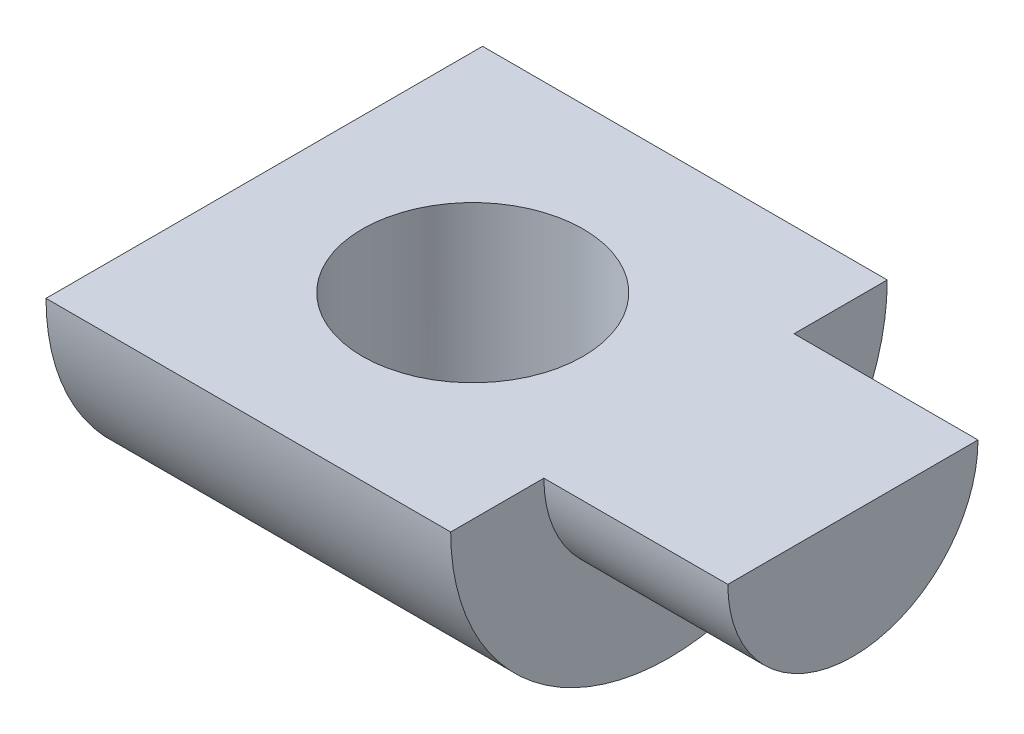
ISO-10303-21;
HEADER;
FILE_DESCRIPTION(('STEP AP214'),'2;1');
FILE_NAME('part.step','',(''),(''),'','','');
FILE_SCHEMA(('AUTOMOTIVE_DESIGN { 1 0 10303 214 1 1 1 1 }'));
ENDSEC;
DATA;
#1=APPLICATION_CONTEXT('core data for automotive mechanical design processes');
#2=APPLICATION_PROTOCOL_DEFINITION('international standard','automotive_design',2000,#1);
#3=PRODUCT_CONTEXT('',#1,'mechanical');
#4=PRODUCT('Part','Part','',(#3));
#5=PRODUCT_RELATED_PRODUCT_CATEGORY('part','',(#4));
#6=PRODUCT_DEFINITION_FORMATION('','',#4);
#7=PRODUCT_DEFINITION_CONTEXT('part definition',#1,'design');
#8=PRODUCT_DEFINITION('design','',#6,#7);
#9=PRODUCT_DEFINITION_SHAPE('','',#8);
#10=(LENGTH_UNIT() NAMED_UNIT(*) SI_UNIT(.MILLI.,.METRE.));
#11=(NAMED_UNIT(*) PLANE_ANGLE_UNIT() SI_UNIT($,.RADIAN.));
#12=(NAMED_UNIT(*) SI_UNIT($,.STERADIAN.) SOLID_ANGLE_UNIT());
#13=UNCERTAINTY_MEASURE_WITH_UNIT(LENGTH_MEASURE(1.E-05),#10,'distance_accuracy_value','');
#14=(GEOMETRIC_REPRESENTATION_CONTEXT(3) GLOBAL_UNCERTAINTY_ASSIGNED_CONTEXT((#13)) GLOBAL_UNIT_ASSIGNED_CONTEXT((#10,
#11,#12)) REPRESENTATION_CONTEXT('',''));
#15=CARTESIAN_POINT('',(0.,0.,0.));
#16=DIRECTION('',(0.,0.,1.));
#17=DIRECTION('',(1.,0.,0.));
#18=AXIS2_PLACEMENT_3D('',#15,#16,#17);
#19=CARTESIAN_POINT('',(-120.,-89.,-89.));
#20=DIRECTION('',(-1.,0.,0.));
#21=DIRECTION('',(0.,0.,1.));
#22=AXIS2_PLACEMENT_3D('',#19,#20,#21);
#23=PLANE('',#22);
#24=CARTESIAN_POINT('',(-120.,0.,0.));
#25=DIRECTION('',(1.,0.,0.));
#26=DIRECTION('',(0.,0.,-1.));
#27=AXIS2_PLACEMENT_3D('',#24,#25,#26);
#28=CIRCLE('',#27,89.);
#29=CARTESIAN_POINT('',(-120.,0.,89.));
#30=VERTEX_POINT('',#29);
#31=CARTESIAN_POINT('',(-120.,0.,-89.));
#32=VERTEX_POINT('',#31);
#33=EDGE_CURVE('E82',#30,#32,#28,.T.);
#34=ORIENTED_EDGE('',*,*,#33,.F.);
#35=DIRECTION('',(0.,0.,1.));
#36=VECTOR('',#35,1.);
#37=CARTESIAN_POINT('',(-120.,0.,-89.));
#38=LINE('',#37,#36);
#39=EDGE_CURVE('E124',#32,#30,#38,.T.);
#40=ORIENTED_EDGE('',*,*,#39,.F.);
#41=EDGE_LOOP('',(#34,#40));
#42=FACE_BOUND('',#41,.T.);
#43=ADVANCED_FACE('F55',(#42),#23,.T.);
#44=CARTESIAN_POINT('',(45.,-89.,-89.));
#45=DIRECTION('',(-1.,0.,0.));
#46=DIRECTION('',(0.,0.,1.));
#47=AXIS2_PLACEMENT_3D('',#44,#45,#46);
#48=PLANE('',#47);
#49=CARTESIAN_POINT('',(45.,0.,0.));
#50=DIRECTION('',(1.,0.,0.));
#51=DIRECTION('',(0.,0.,1.));
#52=AXIS2_PLACEMENT_3D('',#49,#50,#51);
#53=CIRCLE('',#52,51.);
#54=CARTESIAN_POINT('',(45.,0.,51.));
#55=VERTEX_POINT('',#54);
#56=CARTESIAN_POINT('',(45.,0.,-51.));
#57=VERTEX_POINT('',#56);
#58=EDGE_CURVE('E74',#55,#57,#53,.T.);
#59=ORIENTED_EDGE('',*,*,#58,.F.);
#60=DIRECTION('',(0.,0.,1.));
#61=VECTOR('',#60,1.);
#62=CARTESIAN_POINT('',(45.,0.,-89.));
#63=LINE('',#62,#61);
#64=CARTESIAN_POINT('',(45.,0.,89.));
#65=VERTEX_POINT('',#64);
#66=EDGE_CURVE('E130',#55,#65,#63,.T.);
#67=ORIENTED_EDGE('',*,*,#66,.T.);
#68=CARTESIAN_POINT('',(45.,0.,0.));
#69=DIRECTION('',(1.,0.,0.));
#70=DIRECTION('',(0.,0.,-1.));
#71=AXIS2_PLACEMENT_3D('',#68,#69,#70);
#72=CIRCLE('',#71,89.);
#73=CARTESIAN_POINT('',(45.,0.,-89.));
#74=VERTEX_POINT('',#73);
#75=EDGE_CURVE('E117',#65,#74,#72,.T.);
#76=ORIENTED_EDGE('',*,*,#75,.T.);
#77=EDGE_CURVE('E131',#74,#57,#63,.T.);
#78=ORIENTED_EDGE('',*,*,#77,.T.);
#79=EDGE_LOOP('',(#59,#67,#76,#78));
#80=FACE_BOUND('',#79,.T.);
#81=ADVANCED_FACE('F135',(#80),#48,.F.);
#82=CARTESIAN_POINT('',(0.,0.,0.));
#83=DIRECTION('',(0.,1.,0.));
#84=DIRECTION('',(0.,0.,1.));
#85=AXIS2_PLACEMENT_3D('',#82,#83,#84);
#86=PLANE('',#85);
#87=CARTESIAN_POINT('',(-35.,0.,0.));
#88=DIRECTION('',(0.,1.,0.));
#89=DIRECTION('',(0.,0.,1.));
#90=AXIS2_PLACEMENT_3D('',#87,#88,#89);
#91=CIRCLE('',#90,45.);
#92=CARTESIAN_POINT('',(-35.,0.,45.));
#93=VERTEX_POINT('',#92);
#94=EDGE_CURVE('E163',#93,#93,#91,.T.);
#95=ORIENTED_EDGE('',*,*,#94,.F.);
#96=EDGE_LOOP('',(#95));
#97=FACE_BOUND('',#96,.T.);
#98=ORIENTED_EDGE('',*,*,#39,.T.);
#99=DIRECTION('',(1.,0.,0.));
#100=VECTOR('',#99,1.);
#101=CARTESIAN_POINT('',(-120.,0.,89.));
#102=LINE('',#101,#100);
#103=EDGE_CURVE('E127',#30,#65,#102,.T.);
#104=ORIENTED_EDGE('',*,*,#103,.T.);
#105=ORIENTED_EDGE('',*,*,#66,.F.);
#106=DIRECTION('',(-1.,0.,0.));
#107=VECTOR('',#106,1.);
#108=CARTESIAN_POINT('',(120.,0.,51.));
#109=LINE('',#108,#107);
#110=CARTESIAN_POINT('',(120.,0.,51.));
#111=VERTEX_POINT('',#110);
#112=EDGE_CURVE('E108',#111,#55,#109,.T.);
#113=ORIENTED_EDGE('',*,*,#112,.F.);
#114=DIRECTION('',(0.,0.,1.));
#115=VECTOR('',#114,1.);
#116=CARTESIAN_POINT('',(120.,0.,51.));
#117=LINE('',#116,#115);
#118=CARTESIAN_POINT('',(120.,0.,-51.));
#119=VERTEX_POINT('',#118);
#120=EDGE_CURVE('E100',#119,#111,#117,.T.);
#121=ORIENTED_EDGE('',*,*,#120,.F.);
#122=DIRECTION('',(-1.,0.,0.));
#123=VECTOR('',#122,1.);
#124=CARTESIAN_POINT('',(120.,0.,-51.));
#125=LINE('',#124,#123);
#126=EDGE_CURVE('E106',#119,#57,#125,.T.);
#127=ORIENTED_EDGE('',*,*,#126,.T.);
#128=ORIENTED_EDGE('',*,*,#77,.F.);
#129=DIRECTION('',(1.,0.,0.));
#130=VECTOR('',#129,1.);
#131=CARTESIAN_POINT('',(-120.,0.,-89.));
#132=LINE('',#131,#130);
#133=EDGE_CURVE('E67',#32,#74,#132,.T.);
#134=ORIENTED_EDGE('',*,*,#133,.F.);
#135=EDGE_LOOP('',(#98,#104,#105,#113,#121,#127,#128,#134));
#136=FACE_BOUND('',#135,.T.);
#137=ADVANCED_FACE('F103',(#97,#136),#86,.T.);
#138=CARTESIAN_POINT('',(-120.,0.,0.));
#139=DIRECTION('',(1.,0.,0.));
#140=DIRECTION('',(0.,0.,-1.));
#141=AXIS2_PLACEMENT_3D('',#138,#139,#140);
#142=CYLINDRICAL_SURFACE('',#141,89.);
#143=CARTESIAN_POINT('',(10.,-89.,0.));
#144=CARTESIAN_POINT('',(10.0000010030313,-88.9999998439025,1.18182985943779));
#145=CARTESIAN_POINT('',(9.95339390727726,-88.9764077173794,2.36365668518147));
#146=CARTESIAN_POINT('',(9.76751434671571,-88.8826414703674,4.71861853814795));
#147=CARTESIAN_POINT('',(9.62820294588296,-88.8124477771401,5.89174970374893));
#148=CARTESIAN_POINT('',(9.25827534021747,-88.6271363695372,8.22186010627897));
#149=CARTESIAN_POINT('',(9.02751053396322,-88.5119455443042,9.37880986684622));
#150=CARTESIAN_POINT('',(8.47738342582844,-88.2395932521171,11.6662259629907));
#151=CARTESIAN_POINT('',(8.15802962881062,-88.0824358141633,12.796694829537));
#152=CARTESIAN_POINT('',(7.43555859632128,-87.7307102903986,15.0194457197857));
#153=CARTESIAN_POINT('',(7.0327765709582,-87.536292142817,16.1118607269248));
#154=CARTESIAN_POINT('',(6.14653383714491,-87.1142093737057,18.2567633368793));
#155=CARTESIAN_POINT('',(5.66307147376548,-86.8865440702164,19.3092501201365));
#156=CARTESIAN_POINT('',(4.61964964512856,-86.4031420355826,21.3685655753459));
#157=CARTESIAN_POINT('',(4.05970360240096,-86.1474102315224,22.3754022174818));
#158=CARTESIAN_POINT('',(2.8673602856849,-85.613391927887,24.3389086686996));
#159=CARTESIAN_POINT('',(2.23496038189369,-85.3351046097389,25.2955766550096));
#160=CARTESIAN_POINT('',(0.860731594725663,-84.7442263280005,27.2118014398603));
#161=CARTESIAN_POINT('',(0.114566320501081,-84.4305782468778,28.1679233268845));
#162=CARTESIAN_POINT('',(-1.45030879334021,-83.7918348310387,30.0147178838459));
#163=CARTESIAN_POINT('',(-2.26902115373621,-83.4667390987897,30.9053882775844));
#164=CARTESIAN_POINT('',(-3.97528336942585,-82.8125100740948,32.6179247262765));
#165=CARTESIAN_POINT('',(-4.86288259028596,-82.4833740311632,33.4397405452254));
#166=CARTESIAN_POINT('',(-6.70225152773574,-81.8292351948245,35.0099961187395));
#167=CARTESIAN_POINT('',(-7.65402412429292,-81.5042325876966,35.7584325764876));
#168=CARTESIAN_POINT('',(-9.69609200489174,-80.8410931647919,37.2347114452383));
#169=CARTESIAN_POINT('',(-10.7913790686342,-80.5039819092999,37.9561297747497));
#170=CARTESIAN_POINT('',(-13.0464140808275,-79.8548324457494,39.3035017198727));
#171=CARTESIAN_POINT('',(-14.2061664491973,-79.5427959604822,39.929448778668));
#172=CARTESIAN_POINT('',(-16.5830066067581,-78.9548032285684,41.0798781604985));
#173=CARTESIAN_POINT('',(-17.8000621226,-78.6788269956248,41.6044167668764));
#174=CARTESIAN_POINT('',(-20.2842337974546,-78.1733714804802,42.5465655994272));
#175=CARTESIAN_POINT('',(-21.5513442647614,-77.9438869298321,42.9641879427891));
#176=CARTESIAN_POINT('',(-24.0483393281611,-77.5532819722144,43.6650857799282));
#177=CARTESIAN_POINT('',(-25.275858212693,-77.388872541737,43.9549461305174));
#178=CARTESIAN_POINT('',(-27.7570266560354,-77.116412144686,44.4312349396143));
#179=CARTESIAN_POINT('',(-29.0106750704645,-77.0083587152894,44.6176679180414));
#180=CARTESIAN_POINT('',(-31.5319022246883,-76.8534066544853,44.884048026579));
#181=CARTESIAN_POINT('',(-32.7994676983532,-76.8064541522141,44.9640889607157));
#182=CARTESIAN_POINT('',(-35.3375356771438,-76.7756761764582,45.0166269936528));
#183=CARTESIAN_POINT('',(-36.6080378780632,-76.791844433729,44.9891347728003));
#184=CARTESIAN_POINT('',(-38.9837131997039,-76.8806768396474,44.8371227508237));
#185=CARTESIAN_POINT('',(-40.0899764194608,-76.9461375591599,44.7249701344658));
#186=CARTESIAN_POINT('',(-42.2874975172384,-77.1226842740115,44.4198454129689));
#187=CARTESIAN_POINT('',(-43.3787568351301,-77.2337658592457,44.2268811197453));
#188=CARTESIAN_POINT('',(-45.5394540189806,-77.4979332253864,43.7623301409023));
#189=CARTESIAN_POINT('',(-46.6088860921499,-77.6510300050045,43.4907228671454));
#190=CARTESIAN_POINT('',(-48.7194465858416,-77.9944788806515,42.8717433075261));
#191=CARTESIAN_POINT('',(-49.7605734666775,-78.1848329987274,42.5243669093706));
#192=CARTESIAN_POINT('',(-51.8328716696369,-78.6021091424687,41.7481367255762));
#193=CARTESIAN_POINT('',(-52.8632552050518,-78.8297753909186,41.317583633805));
#194=CARTESIAN_POINT('',(-54.8839911274024,-79.3121058603394,40.3839793519615));
#195=CARTESIAN_POINT('',(-55.8743435120302,-79.5667700828668,39.8809281577098));
#196=CARTESIAN_POINT('',(-57.8113364167182,-80.0967468236436,38.805546978376));
#197=CARTESIAN_POINT('',(-58.7579619035765,-80.3720663590215,38.2331934086239));
#198=CARTESIAN_POINT('',(-60.6036582264585,-80.9368594381598,37.0225735342624));
#199=CARTESIAN_POINT('',(-61.5027258214643,-81.2263339439857,36.3843027461958));
#200=CARTESIAN_POINT('',(-63.3638145482479,-81.8513339186126,34.9577132451472));
#201=CARTESIAN_POINT('',(-64.3188025279328,-82.1879499796765,34.160677217408));
#202=CARTESIAN_POINT('',(-66.1594038363284,-82.8623861151499,32.4905534913238));
#203=CARTESIAN_POINT('',(-67.0450119321474,-83.200206278372,31.6174600669126));
#204=CARTESIAN_POINT('',(-68.7426531640185,-83.8686923193167,29.7990126535701));
#205=CARTESIAN_POINT('',(-69.554650395522,-84.1993546465031,28.8536238117644));
#206=CARTESIAN_POINT('',(-71.0997505975649,-84.8451494927693,26.8954176177406));
#207=CARTESIAN_POINT('',(-71.8328529148482,-85.1602818832482,25.8825997073167));
#208=CARTESIAN_POINT('',(-73.2487063797656,-85.7819294687584,23.7436346701811));
#209=CARTESIAN_POINT('',(-73.9272743912095,-86.0872800820007,22.614371428379));
#210=CARTESIAN_POINT('',(-75.1859105600723,-86.6636852789153,20.2937160010756));
#211=CARTESIAN_POINT('',(-75.7659739561459,-86.9347382046042,19.1023208159843));
#212=CARTESIAN_POINT('',(-76.8210354355691,-87.4344509323347,16.6661832161274));
#213=CARTESIAN_POINT('',(-77.2961016804785,-87.6631382214062,15.4214760405189));
#214=CARTESIAN_POINT('',(-78.1357445660712,-88.0713215556994,12.8875268921654));
#215=CARTESIAN_POINT('',(-78.5003342419984,-88.2508234041222,11.5982901935172));
#216=CARTESIAN_POINT('',(-79.0882098890918,-88.542141739234,9.09614403750853));
#217=CARTESIAN_POINT('',(-79.3207982847071,-88.6583797899632,7.88592951825274));
#218=CARTESIAN_POINT('',(-79.68615369565,-88.8415850011557,5.44683085623072));
#219=CARTESIAN_POINT('',(-79.818926213212,-88.9085548774655,4.21794774635921));
#220=CARTESIAN_POINT('',(-79.9828397819652,-88.9912966573466,1.75221342532658));
#221=CARTESIAN_POINT('',(-80.0140228038991,-89.0070897041284,0.515365716334475));
#222=CARTESIAN_POINT('',(-79.9744423109755,-88.9870783288063,-1.95624957280077));
#223=CARTESIAN_POINT('',(-79.9036835095575,-88.9512762922817,-3.19101724647484));
#224=CARTESIAN_POINT('',(-79.670897729679,-88.8340028816502,-5.54992253007338));
#225=CARTESIAN_POINT('',(-79.5166023197099,-88.7564027937962,-6.67502724544239));
#226=CARTESIAN_POINT('',(-79.1242782035907,-88.5602791623837,-8.90683079745567));
#227=CARTESIAN_POINT('',(-78.8862550339718,-88.4417583247357,-10.0135308460495));
#228=CARTESIAN_POINT('',(-78.3289671031652,-88.1665511419505,-12.2014422063803));
#229=CARTESIAN_POINT('',(-78.0096978995912,-88.0098627098983,-13.2826521208295));
#230=CARTESIAN_POINT('',(-77.2930168439232,-87.6618571047019,-15.4131116327079));
#231=CARTESIAN_POINT('',(-76.8956016882371,-87.4705384676053,-16.4623598768025));
#232=CARTESIAN_POINT('',(-76.013923237419,-87.0516355062275,-18.5520894510536));
#233=CARTESIAN_POINT('',(-75.5275379498505,-86.8231850173684,-19.5915007953003));
#234=CARTESIAN_POINT('',(-74.4798609229528,-86.3391199869065,-21.6251963747952));
#235=CARTESIAN_POINT('',(-73.9185685643631,-86.0835052207388,-22.6194802368811));
#236=CARTESIAN_POINT('',(-72.7248944929662,-85.5504670272511,-24.5586881337806));
#237=CARTESIAN_POINT('',(-72.0924900031533,-85.2730366210506,-25.5035962109216));
#238=CARTESIAN_POINT('',(-70.7606157816932,-84.7021822271783,-27.3398042995988));
#239=CARTESIAN_POINT('',(-70.0611423192739,-84.4087573501916,-28.231101324479));
#240=CARTESIAN_POINT('',(-68.5257855512377,-83.782093169175,-30.0427874906861));
#241=CARTESIAN_POINT('',(-67.6832557282761,-83.4478052006095,-30.9571845068617));
#242=CARTESIAN_POINT('',(-65.9261166276901,-82.7753948995628,-32.7126493899891));
#243=CARTESIAN_POINT('',(-65.0115028576307,-82.4372723292266,-33.5537126797255));
#244=CARTESIAN_POINT('',(-63.5888901612746,-81.9336791823222,-34.7571831405909));
#245=CARTESIAN_POINT('',(-63.1059953697332,-81.7663344710569,-35.1488250674978));
#246=CARTESIAN_POINT('',(-62.1239039296453,-81.4339773442708,-35.9121221777664));
#247=CARTESIAN_POINT('',(-61.6247086533993,-81.268964734083,-36.2837790366885));
#248=CARTESIAN_POINT('',(-60.6106200005836,-80.9424083554388,-37.006537106819));
#249=CARTESIAN_POINT('',(-60.0957280811708,-80.7808642673497,-37.3576402172976));
#250=CARTESIAN_POINT('',(-59.0506654878417,-80.4623309403534,-38.0388583701742));
#251=CARTESIAN_POINT('',(-58.5204899124634,-80.305343195796,-38.3689665682035));
#252=CARTESIAN_POINT('',(-56.8528144239274,-79.827147855753,-39.3596515802034));
#253=CARTESIAN_POINT('',(-55.6902095853036,-79.5157199071406,-39.9832942747592));
#254=CARTESIAN_POINT('',(-53.3071803452078,-78.9292119193218,-41.1289956618072));
#255=CARTESIAN_POINT('',(-52.0867623616855,-78.6541278582961,-41.6510655973808));
#256=CARTESIAN_POINT('',(-50.2195820082019,-78.2768408526638,-42.353352759111));
#257=CARTESIAN_POINT('',(-49.5912893453391,-78.1569988735879,-42.5739250563529));
#258=CARTESIAN_POINT('',(-48.3235305856865,-77.9302753407571,-42.9875313847186));
#259=CARTESIAN_POINT('',(-47.6840674174077,-77.823390446766,-43.1805725154385));
#260=CARTESIAN_POINT('',(-46.3951343759827,-77.62373226537,-43.5384683060817));
#261=CARTESIAN_POINT('',(-45.7456647734172,-77.5309585971231,-43.7033237267124));
#262=CARTESIAN_POINT('',(-44.4381375997202,-77.3605707975417,-44.0042251033591));
#263=CARTESIAN_POINT('',(-43.7800796903841,-77.2829572651417,-44.1402699211666));
#264=CARTESIAN_POINT('',(-41.9232259140756,-77.087747494497,-44.4808296313674));
#265=CARTESIAN_POINT('',(-40.7161682026391,-76.9883579906867,-44.6521300869711));
#266=CARTESIAN_POINT('',(-38.2890179137587,-76.8462719771095,-44.8962178763138));
#267=CARTESIAN_POINT('',(-37.068926238497,-76.8035715687525,-44.9690119844818));
#268=CARTESIAN_POINT('',(-34.6266636694278,-76.776619291525,-45.0150142383316));
#269=CARTESIAN_POINT('',(-33.404493797837,-76.7923441397071,-44.9882620540269));
#270=CARTESIAN_POINT('',(-30.9685429600012,-76.8815401585934,-44.8356617339888));
#271=CARTESIAN_POINT('',(-29.7547616227978,-76.9550087590514,-44.7098180089423));
#272=CARTESIAN_POINT('',(-27.4660328101158,-77.1465617425327,-44.3783770308311));
#273=CARTESIAN_POINT('',(-26.3893000862404,-77.2594725956077,-44.1819733487701));
#274=CARTESIAN_POINT('',(-24.2578932274693,-77.5259631748705,-43.7126730944471));
#275=CARTESIAN_POINT('',(-23.2032172674858,-77.6795395217098,-43.4397828781924));
#276=CARTESIAN_POINT('',(-21.1215905164407,-78.0227902470535,-42.8201991808957));
#277=CARTESIAN_POINT('',(-20.0946464080377,-78.212473239237,-42.4734880866418));
#278=CARTESIAN_POINT('',(-18.0737598222698,-78.622632403261,-41.7093464944405));
#279=CARTESIAN_POINT('',(-17.0798195637314,-78.843110640278,-41.291911253223));
#280=CARTESIAN_POINT('',(-15.0639223532916,-79.3248135379437,-40.3592302160812));
#281=CARTESIAN_POINT('',(-14.0445462033073,-79.5877780687188,-39.8393065247118));
#282=CARTESIAN_POINT('',(-12.052690162703,-80.1352717853536,-38.7262542847718));
#283=CARTESIAN_POINT('',(-11.0802116026122,-80.4198015824522,-38.1331236609483));
#284=CARTESIAN_POINT('',(-9.1855642658789,-81.0035333159182,-36.8769220017111));
#285=CARTESIAN_POINT('',(-8.26341717811373,-81.3027414736748,-36.2138211701213));
#286=CARTESIAN_POINT('',(-6.47336604906056,-81.9088485806784,-34.8212185774511));
#287=CARTESIAN_POINT('',(-5.60546523248328,-82.2157479856212,-34.0917128752028));
#288=CARTESIAN_POINT('',(-3.82205099177611,-82.8691276839541,-32.4740016614013));
#289=CARTESIAN_POINT('',(-2.914213497829,-83.2157456704897,-31.5773665982301));
#290=CARTESIAN_POINT('',(-1.17649726077127,-83.9010829503569,-29.7085664673921));
#291=CARTESIAN_POINT('',(-0.346625294528281,-84.2398015551436,-28.7363948473807));
#292=CARTESIAN_POINT('',(1.23038053717481,-84.9006925823856,-26.7207349281338));
#293=CARTESIAN_POINT('',(1.97746418442111,-85.2228548991911,-25.6772039571631));
#294=CARTESIAN_POINT('',(3.38270376207283,-85.8419132821191,-23.5248802167585));
#295=CARTESIAN_POINT('',(4.04086458312608,-86.1388107374456,-22.416091041266));
#296=CARTESIAN_POINT('',(5.26856935867945,-86.7021169388354,-20.1281662124387));
#297=CARTESIAN_POINT('',(5.8371915542898,-86.9682019203354,-18.9484524043434));
#298=CARTESIAN_POINT('',(6.61320199996047,-87.3361724521982,-17.1397938805661));
#299=CARTESIAN_POINT('',(6.8591007017198,-87.4536605598524,-16.5302443539131));
#300=CARTESIAN_POINT('',(7.32455806644486,-87.6774000879248,-15.2991696598174));
#301=CARTESIAN_POINT('',(7.54411992799784,-87.7836528726775,-14.6776459572912));
#302=CARTESIAN_POINT('',(7.9557382707625,-87.9838803971057,-13.4252764909526));
#303=CARTESIAN_POINT('',(8.14785830334641,-88.0778834595815,-12.7944561247566));
#304=CARTESIAN_POINT('',(8.50455872724172,-88.2531727308835,-11.5234102037628));
#305=CARTESIAN_POINT('',(8.66914260675328,-88.3344605503549,-10.8831858514289));
#306=CARTESIAN_POINT('',(8.97015922901381,-88.4836585050374,-9.59491889066141));
#307=CARTESIAN_POINT('',(9.10660466174899,-88.5515746700205,-8.94687994666929));
#308=CARTESIAN_POINT('',(9.35092774188485,-88.6735224210588,-7.64423095877573));
#309=CARTESIAN_POINT('',(9.45880967905085,-88.7275560919993,-6.98962191693866));
#310=CARTESIAN_POINT('',(9.6266103498986,-88.8117685177381,-5.80905713773796));
#311=CARTESIAN_POINT('',(9.69182210956525,-88.8445641599966,-5.28403431425156));
#312=CARTESIAN_POINT('',(9.80371399983058,-88.900902683698,-4.23169038058623));
#313=CARTESIAN_POINT('',(9.85039923108449,-88.9244481118576,-3.70436994345439));
#314=CARTESIAN_POINT('',(9.96251143008374,-88.9810253204445,-2.11979457165344));
#315=CARTESIAN_POINT('',(9.9999991004552,-89.0000001399923,-1.05989606583064));
#316=CARTESIAN_POINT('',(10.,-89.,0.));
#317=B_SPLINE_CURVE_WITH_KNOTS('',3,(#143,#144,#145,#146,#147,#148,#149,#150,#151,#152,#153,
#154,#155,#156,#157,#158,#159,#160,#161,#162,#163,#164,#165,#166,#167,#168,#169,#170,#171,#172,
#173,#174,#175,#176,#177,#178,#179,#180,#181,#182,#183,#184,#185,#186,#187,#188,#189,#190,#191,
#192,#193,#194,#195,#196,#197,#198,#199,#200,#201,#202,#203,#204,#205,#206,#207,#208,#209,#210,
#211,#212,#213,#214,#215,#216,#217,#218,#219,#220,#221,#222,#223,#224,#225,#226,#227,#228,#229,
#230,#231,#232,#233,#234,#235,#236,#237,#238,#239,#240,#241,#242,#243,#244,#245,#246,#247,#248,
#249,#250,#251,#252,#253,#254,#255,#256,#257,#258,#259,#260,#261,#262,#263,#264,#265,#266,#267,
#268,#269,#270,#271,#272,#273,#274,#275,#276,#277,#278,#279,#280,#281,#282,#283,#284,#285,#286,
#287,#288,#289,#290,#291,#292,#293,#294,#295,#296,#297,#298,#299,#300,#301,#302,#303,#304,#305,
#306,#307,#308,#309,#310,#311,#312,#313,#314,#315,#316),.UNSPECIFIED.,.T.,.F.,(4,2,2,2,2,2,2,2,
2,2,2,2,2,2,2,2,2,2,2,2,2,2,2,2,2,2,2,2,2,2,2,2,2,2,2,2,2,2,2,2,2,2,2,2,2,2,2,2,2,2,2,2,2,2,2,2,
2,2,2,2,2,2,2,2,2,2,2,2,2,2,2,2,2,2,2,2,2,2,2,2,2,2,2,2,2,2,4),(0.,3.54433867640859,
7.09016692371495,10.6417805196754,14.1930532658504,17.7303247513242,21.2676688028506,
24.8043928626502,28.3412453329289,32.0954359273505,35.8497570190815,39.6067938180459,
43.3639993373704,47.4214214248652,51.4791220443591,55.5345640674963,59.5895462697268,
63.3999041880293,67.2100955753001,71.0169253494582,74.8233770334312,78.1610167631775,
81.498333923912,84.8365255601991,88.1748984185772,91.5905174176468,95.0061366136316,
98.4229214820158,101.839938901326,105.701625778916,109.563603639596,113.427455201665,
117.291338754272,121.343150343737,125.395157726933,129.444526869813,133.493418037257,
137.201926206781,140.910229934107,144.61700141628,148.323601515586,151.734495409628,
155.14516379935,158.556018718337,161.967017860997,165.473621001346,168.980253132759,
172.48801164465,175.995965392097,179.854440803815,183.713156874916,185.644353832579,
187.575388624243,189.506244695959,191.437727036456,195.498800797662,199.55942478284,
201.588525615546,203.617102244315,205.645624114951,207.674226110608,211.338173200876,
215.001868303212,218.664103549411,222.326175794202,225.623445214502,228.920440713926,
232.218223739675,235.516228026102,239.035076966738,242.554025681801,246.074479003298,
249.595141402161,253.55726737064,257.519737414374,261.484598028985,265.449240492216,
269.452349721631,271.454851309588,273.457109448632,275.454652731375,277.451942779212,
279.448330102053,281.444417430198,283.034228151984,284.623600868797,287.802256907225),.UNSPECIFIED.);
#318=CARTESIAN_POINT('',(10.,-89.,0.));
#319=VERTEX_POINT('',#318);
#320=EDGE_CURVE('E12',#319,#319,#317,.T.);
#321=ORIENTED_EDGE('',*,*,#320,.F.);
#322=EDGE_LOOP('',(#321));
#323=FACE_BOUND('',#322,.T.);
#324=ORIENTED_EDGE('',*,*,#75,.F.);
#325=ORIENTED_EDGE('',*,*,#103,.F.);
#326=ORIENTED_EDGE('',*,*,#33,.T.);
#327=ORIENTED_EDGE('',*,*,#133,.T.);
#328=EDGE_LOOP('',(#324,#325,#326,#327));
#329=FACE_BOUND('',#328,.T.);
#330=ADVANCED_FACE('F133',(#323,#329),#142,.T.);
#331=CARTESIAN_POINT('',(120.,0.,0.));
#332=DIRECTION('',(-1.,0.,0.));
#333=DIRECTION('',(0.,0.,1.));
#334=AXIS2_PLACEMENT_3D('',#331,#332,#333);
#335=CYLINDRICAL_SURFACE('',#334,51.);
#336=ORIENTED_EDGE('',*,*,#58,.T.);
#337=ORIENTED_EDGE('',*,*,#126,.F.);
#338=CARTESIAN_POINT('',(120.,0.,0.));
#339=DIRECTION('',(1.,0.,0.));
#340=DIRECTION('',(0.,0.,1.));
#341=AXIS2_PLACEMENT_3D('',#338,#339,#340);
#342=CIRCLE('',#341,51.);
#343=EDGE_CURVE('E111',#111,#119,#342,.T.);
#344=ORIENTED_EDGE('',*,*,#343,.F.);
#345=ORIENTED_EDGE('',*,*,#112,.T.);
#346=EDGE_LOOP('',(#336,#337,#344,#345));
#347=FACE_BOUND('',#346,.T.);
#348=ADVANCED_FACE('F116',(#347),#335,.T.);
#349=CARTESIAN_POINT('',(120.,0.,0.));
#350=DIRECTION('',(-1.,0.,0.));
#351=DIRECTION('',(0.,0.,1.));
#352=AXIS2_PLACEMENT_3D('',#349,#350,#351);
#353=PLANE('',#352);
#354=ORIENTED_EDGE('',*,*,#343,.T.);
#355=ORIENTED_EDGE('',*,*,#120,.T.);
#356=EDGE_LOOP('',(#354,#355));
#357=FACE_BOUND('',#356,.T.);
#358=ADVANCED_FACE('F113',(#357),#353,.F.);
#359=CARTESIAN_POINT('',(-35.,-89.,0.));
#360=DIRECTION('',(0.,1.,0.));
#361=DIRECTION('',(0.,0.,1.));
#362=AXIS2_PLACEMENT_3D('',#359,#360,#361);
#363=CYLINDRICAL_SURFACE('',#362,45.);
#364=ORIENTED_EDGE('',*,*,#320,.T.);
#365=EDGE_LOOP('',(#364));
#366=FACE_BOUND('',#365,.T.);
#367=ORIENTED_EDGE('',*,*,#94,.T.);
#368=EDGE_LOOP('',(#367));
#369=FACE_BOUND('',#368,.T.);
#370=ADVANCED_FACE('F153',(#366,#369),#363,.F.);
#371=CLOSED_SHELL('',(#43,#81,#137,#330,#348,#358,#370));
#372=MANIFOLD_SOLID_BREP('B2',#371);
#373=ADVANCED_BREP_SHAPE_REPRESENTATION('',(#18,#372),#14);
#374=SHAPE_DEFINITION_REPRESENTATION(#9,#373);
ENDSEC;
END-ISO-10303-21;
